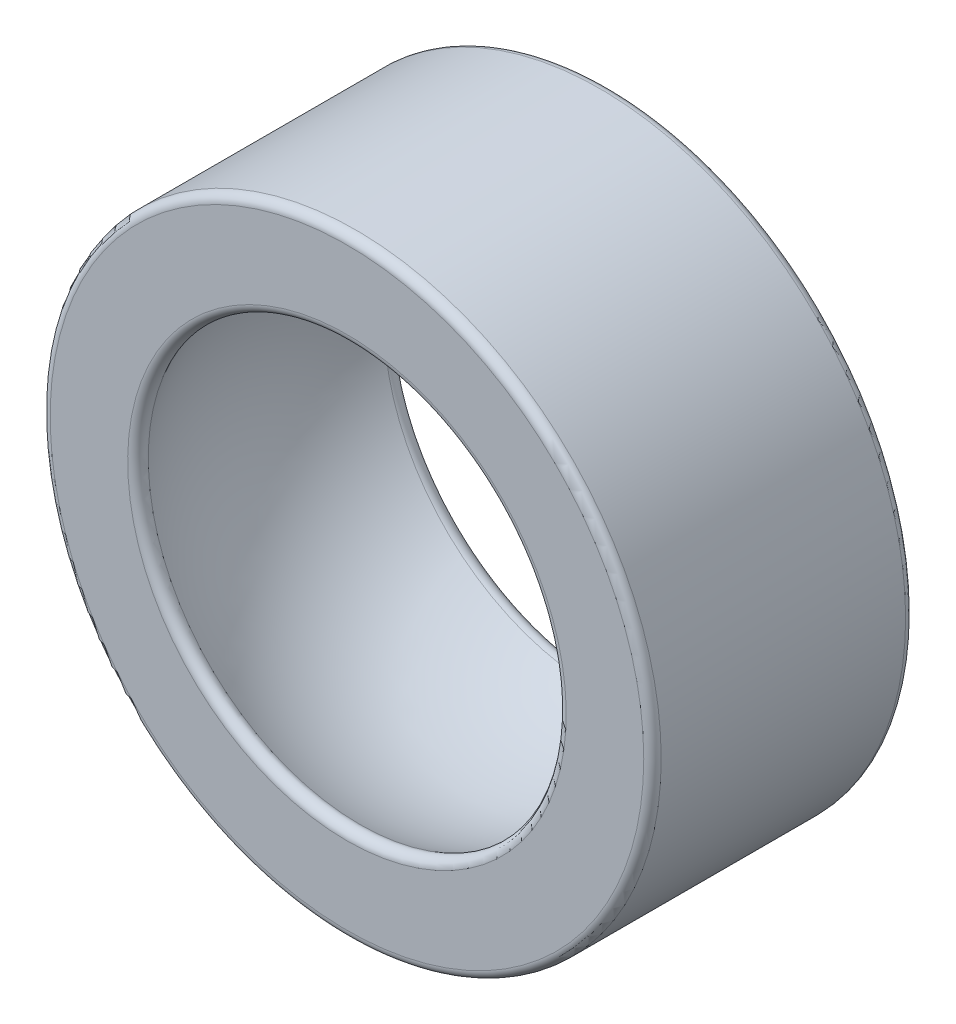
ISO-10303-21;
HEADER;
FILE_DESCRIPTION(('STEP AP214'),'2;1');
FILE_NAME('part.step','',(''),(''),'','','');
FILE_SCHEMA(('AUTOMOTIVE_DESIGN { 1 0 10303 214 1 1 1 1 }'));
ENDSEC;
DATA;
#1=APPLICATION_CONTEXT('core data for automotive mechanical design processes');
#2=APPLICATION_PROTOCOL_DEFINITION('international standard','automotive_design',2000,#1);
#3=PRODUCT_CONTEXT('',#1,'mechanical');
#4=PRODUCT('Part','Part','',(#3));
#5=PRODUCT_RELATED_PRODUCT_CATEGORY('part','',(#4));
#6=PRODUCT_DEFINITION_FORMATION('','',#4);
#7=PRODUCT_DEFINITION_CONTEXT('part definition',#1,'design');
#8=PRODUCT_DEFINITION('design','',#6,#7);
#9=PRODUCT_DEFINITION_SHAPE('','',#8);
#10=(LENGTH_UNIT() NAMED_UNIT(*) SI_UNIT(.MILLI.,.METRE.));
#11=(NAMED_UNIT(*) PLANE_ANGLE_UNIT() SI_UNIT($,.RADIAN.));
#12=(NAMED_UNIT(*) SI_UNIT($,.STERADIAN.) SOLID_ANGLE_UNIT());
#13=UNCERTAINTY_MEASURE_WITH_UNIT(LENGTH_MEASURE(1.E-05),#10,'distance_accuracy_value','');
#14=(GEOMETRIC_REPRESENTATION_CONTEXT(3) GLOBAL_UNCERTAINTY_ASSIGNED_CONTEXT((#13)) GLOBAL_UNIT_ASSIGNED_CONTEXT((#10,
#11,#12)) REPRESENTATION_CONTEXT('',''));
#15=CARTESIAN_POINT('',(0.,0.,0.));
#16=DIRECTION('',(0.,0.,1.));
#17=DIRECTION('',(1.,0.,0.));
#18=AXIS2_PLACEMENT_3D('',#15,#16,#17);
#19=CARTESIAN_POINT('',(0.,0.,-2.8));
#20=DIRECTION('',(0.,0.,-1.));
#21=DIRECTION('',(-1.,0.,0.));
#22=AXIS2_PLACEMENT_3D('',#19,#20,#21);
#23=TOROIDAL_SURFACE('',#22,6.8,0.2);
#24=CARTESIAN_POINT('',(0.,0.,-2.8));
#25=DIRECTION('',(0.,0.,-1.));
#26=DIRECTION('',(-1.,0.,0.));
#27=AXIS2_PLACEMENT_3D('',#24,#25,#26);
#28=CIRCLE('',#27,7.);
#29=CARTESIAN_POINT('',(7.,0.,-2.8));
#30=VERTEX_POINT('',#29);
#31=EDGE_CURVE('E11',#30,#30,#28,.T.);
#32=ORIENTED_EDGE('',*,*,#31,.T.);
#33=EDGE_LOOP('',(#32));
#34=FACE_BOUND('',#33,.T.);
#35=CARTESIAN_POINT('',(0.,0.,-3.));
#36=DIRECTION('',(0.,0.,1.));
#37=DIRECTION('',(-1.,0.,0.));
#38=AXIS2_PLACEMENT_3D('',#35,#36,#37);
#39=CIRCLE('',#38,6.8);
#40=CARTESIAN_POINT('',(6.8,0.,-3.));
#41=VERTEX_POINT('',#40);
#42=EDGE_CURVE('E26',#41,#41,#39,.T.);
#43=ORIENTED_EDGE('',*,*,#42,.T.);
#44=EDGE_LOOP('',(#43));
#45=FACE_BOUND('',#44,.T.);
#46=ADVANCED_FACE('F16',(#34,#45),#23,.T.);
#47=CARTESIAN_POINT('',(0.,0.,-3.));
#48=DIRECTION('',(0.,0.,1.));
#49=DIRECTION('',(1.,0.,0.));
#50=AXIS2_PLACEMENT_3D('',#47,#48,#49);
#51=PLANE('',#50);
#52=CARTESIAN_POINT('',(0.,0.,-3.));
#53=DIRECTION('',(0.,0.,-1.));
#54=DIRECTION('',(0.,-1.,0.));
#55=AXIS2_PLACEMENT_3D('',#52,#53,#54);
#56=CIRCLE('',#55,5.02426319013724);
#57=CARTESIAN_POINT('',(0.,5.02426319013724,-3.));
#58=VERTEX_POINT('',#57);
#59=EDGE_CURVE('E58',#58,#58,#56,.T.);
#60=ORIENTED_EDGE('',*,*,#59,.F.);
#61=EDGE_LOOP('',(#60));
#62=FACE_BOUND('',#61,.T.);
#63=ORIENTED_EDGE('',*,*,#42,.F.);
#64=EDGE_LOOP('',(#63));
#65=FACE_BOUND('',#64,.T.);
#66=ADVANCED_FACE('F86',(#62,#65),#51,.F.);
#67=CARTESIAN_POINT('',(0.,0.,0.));
#68=DIRECTION('',(0.,0.,-1.));
#69=DIRECTION('',(-1.,0.,0.));
#70=AXIS2_PLACEMENT_3D('',#67,#68,#69);
#71=CYLINDRICAL_SURFACE('',#70,7.);
#72=CARTESIAN_POINT('',(0.,0.,2.8));
#73=DIRECTION('',(0.,0.,1.));
#74=DIRECTION('',(-1.,0.,0.));
#75=AXIS2_PLACEMENT_3D('',#72,#73,#74);
#76=CIRCLE('',#75,7.);
#77=CARTESIAN_POINT('',(7.,0.,2.8));
#78=VERTEX_POINT('',#77);
#79=EDGE_CURVE('E20',#78,#78,#76,.T.);
#80=ORIENTED_EDGE('',*,*,#79,.F.);
#81=EDGE_LOOP('',(#80));
#82=FACE_BOUND('',#81,.T.);
#83=ORIENTED_EDGE('',*,*,#31,.F.);
#84=EDGE_LOOP('',(#83));
#85=FACE_BOUND('',#84,.T.);
#86=ADVANCED_FACE('F18',(#82,#85),#71,.T.);
#87=CARTESIAN_POINT('',(0.,0.,-2.8));
#88=DIRECTION('',(0.,0.,1.));
#89=DIRECTION('',(1.,0.,0.));
#90=AXIS2_PLACEMENT_3D('',#87,#88,#89);
#91=TOROIDAL_SURFACE('',#90,5.02426319013724,0.2);
#92=CARTESIAN_POINT('',(0.,0.,-2.70263919937383));
#93=DIRECTION('',(0.,0.,1.));
#94=DIRECTION('',(0.,-1.,0.));
#95=AXIS2_PLACEMENT_3D('',#92,#93,#94);
#96=CIRCLE('',#95,4.84956094486996);
#97=CARTESIAN_POINT('',(0.,4.84956094486996,-2.70263919937383));
#98=VERTEX_POINT('',#97);
#99=EDGE_CURVE('E63',#98,#98,#96,.T.);
#100=ORIENTED_EDGE('',*,*,#99,.T.);
#101=EDGE_LOOP('',(#100));
#102=FACE_BOUND('',#101,.T.);
#103=ORIENTED_EDGE('',*,*,#59,.T.);
#104=EDGE_LOOP('',(#103));
#105=FACE_BOUND('',#104,.T.);
#106=ADVANCED_FACE('F100',(#102,#105),#91,.T.);
#107=CARTESIAN_POINT('',(0.,0.,0.));
#108=DIRECTION('',(0.,0.,1.));
#109=DIRECTION('',(1.,0.,0.));
#110=AXIS2_PLACEMENT_3D('',#107,#108,#109);
#111=SPHERICAL_SURFACE('',#110,5.55180150942016);
#112=CARTESIAN_POINT('',(0.,0.,2.70263919937383));
#113=DIRECTION('',(0.,0.,-1.));
#114=DIRECTION('',(0.,1.,0.));
#115=AXIS2_PLACEMENT_3D('',#112,#113,#114);
#116=CIRCLE('',#115,4.84956094486996);
#117=CARTESIAN_POINT('',(0.,-4.84956094486996,2.70263919937383));
#118=VERTEX_POINT('',#117);
#119=EDGE_CURVE('E50',#118,#118,#116,.T.);
#120=ORIENTED_EDGE('',*,*,#119,.F.);
#121=EDGE_LOOP('',(#120));
#122=FACE_BOUND('',#121,.T.);
#123=ORIENTED_EDGE('',*,*,#99,.F.);
#124=EDGE_LOOP('',(#123));
#125=FACE_BOUND('',#124,.T.);
#126=ADVANCED_FACE('F80',(#122,#125),#111,.F.);
#127=CARTESIAN_POINT('',(0.,0.,2.8));
#128=DIRECTION('',(0.,0.,-1.));
#129=DIRECTION('',(-1.,0.,0.));
#130=AXIS2_PLACEMENT_3D('',#127,#128,#129);
#131=TOROIDAL_SURFACE('',#130,5.02426319013724,0.2);
#132=ORIENTED_EDGE('',*,*,#119,.T.);
#133=EDGE_LOOP('',(#132));
#134=FACE_BOUND('',#133,.T.);
#135=CARTESIAN_POINT('',(0.,0.,3.));
#136=DIRECTION('',(0.,0.,1.));
#137=DIRECTION('',(0.,1.,0.));
#138=AXIS2_PLACEMENT_3D('',#135,#136,#137);
#139=CIRCLE('',#138,5.02426319013724);
#140=CARTESIAN_POINT('',(0.,-5.02426319013724,3.));
#141=VERTEX_POINT('',#140);
#142=EDGE_CURVE('E54',#141,#141,#139,.T.);
#143=ORIENTED_EDGE('',*,*,#142,.T.);
#144=EDGE_LOOP('',(#143));
#145=FACE_BOUND('',#144,.T.);
#146=ADVANCED_FACE('F70',(#134,#145),#131,.T.);
#147=CARTESIAN_POINT('',(0.,0.,3.));
#148=DIRECTION('',(0.,0.,1.));
#149=DIRECTION('',(1.,0.,0.));
#150=AXIS2_PLACEMENT_3D('',#147,#148,#149);
#151=PLANE('',#150);
#152=CARTESIAN_POINT('',(0.,0.,3.));
#153=DIRECTION('',(0.,0.,-1.));
#154=DIRECTION('',(-1.,0.,0.));
#155=AXIS2_PLACEMENT_3D('',#152,#153,#154);
#156=CIRCLE('',#155,6.8);
#157=CARTESIAN_POINT('',(6.8,0.,3.));
#158=VERTEX_POINT('',#157);
#159=EDGE_CURVE('E61',#158,#158,#156,.T.);
#160=ORIENTED_EDGE('',*,*,#159,.F.);
#161=EDGE_LOOP('',(#160));
#162=FACE_BOUND('',#161,.T.);
#163=ORIENTED_EDGE('',*,*,#142,.F.);
#164=EDGE_LOOP('',(#163));
#165=FACE_BOUND('',#164,.T.);
#166=ADVANCED_FACE('F55',(#162,#165),#151,.T.);
#167=CARTESIAN_POINT('',(0.,0.,2.8));
#168=DIRECTION('',(0.,0.,1.));
#169=DIRECTION('',(1.,0.,0.));
#170=AXIS2_PLACEMENT_3D('',#167,#168,#169);
#171=TOROIDAL_SURFACE('',#170,6.8,0.2);
#172=ORIENTED_EDGE('',*,*,#79,.T.);
#173=EDGE_LOOP('',(#172));
#174=FACE_BOUND('',#173,.T.);
#175=ORIENTED_EDGE('',*,*,#159,.T.);
#176=EDGE_LOOP('',(#175));
#177=FACE_BOUND('',#176,.T.);
#178=ADVANCED_FACE('F67',(#174,#177),#171,.T.);
#179=CLOSED_SHELL('',(#46,#66,#86,#106,#126,#146,#166,#178));
#180=MANIFOLD_SOLID_BREP('B1',#179);
#181=ADVANCED_BREP_SHAPE_REPRESENTATION('',(#18,#180),#14);
#182=SHAPE_DEFINITION_REPRESENTATION(#9,#181);
ENDSEC;
END-ISO-10303-21;
